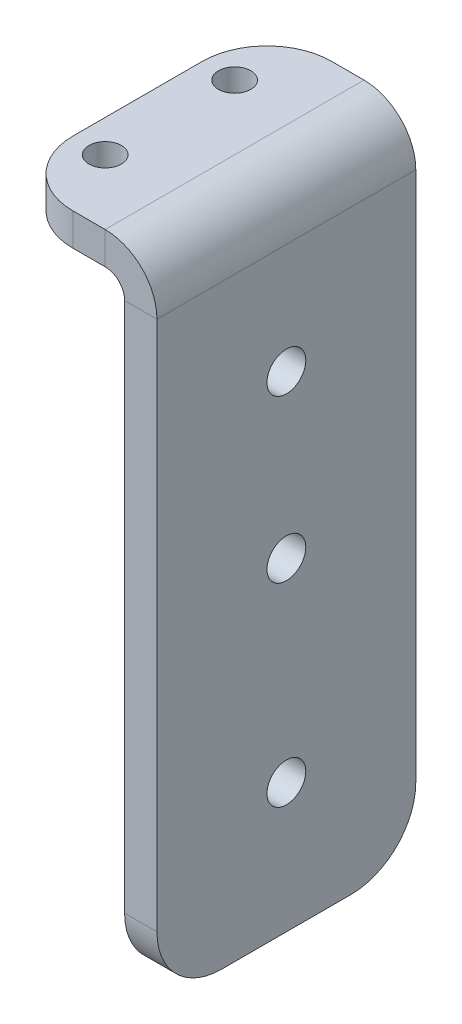
ISO-10303-21;
HEADER;
FILE_DESCRIPTION(('STEP AP214'),'2;1');
FILE_NAME('part.step','',(''),(''),'','','');
FILE_SCHEMA(('AUTOMOTIVE_DESIGN { 1 0 10303 214 1 1 1 1 }'));
ENDSEC;
DATA;
#1=APPLICATION_CONTEXT('core data for automotive mechanical design processes');
#2=APPLICATION_PROTOCOL_DEFINITION('international standard','automotive_design',2000,#1);
#3=PRODUCT_CONTEXT('',#1,'mechanical');
#4=PRODUCT('Part','Part','',(#3));
#5=PRODUCT_RELATED_PRODUCT_CATEGORY('part','',(#4));
#6=PRODUCT_DEFINITION_FORMATION('','',#4);
#7=PRODUCT_DEFINITION_CONTEXT('part definition',#1,'design');
#8=PRODUCT_DEFINITION('design','',#6,#7);
#9=PRODUCT_DEFINITION_SHAPE('','',#8);
#10=(LENGTH_UNIT() NAMED_UNIT(*) SI_UNIT(.MILLI.,.METRE.));
#11=(NAMED_UNIT(*) PLANE_ANGLE_UNIT() SI_UNIT($,.RADIAN.));
#12=(NAMED_UNIT(*) SI_UNIT($,.STERADIAN.) SOLID_ANGLE_UNIT());
#13=UNCERTAINTY_MEASURE_WITH_UNIT(LENGTH_MEASURE(1.E-05),#10,'distance_accuracy_value','');
#14=(GEOMETRIC_REPRESENTATION_CONTEXT(3) GLOBAL_UNCERTAINTY_ASSIGNED_CONTEXT((#13)) GLOBAL_UNIT_ASSIGNED_CONTEXT((#10,
#11,#12)) REPRESENTATION_CONTEXT('',''));
#15=CARTESIAN_POINT('',(0.,0.,0.));
#16=DIRECTION('',(0.,0.,1.));
#17=DIRECTION('',(1.,0.,0.));
#18=AXIS2_PLACEMENT_3D('',#15,#16,#17);
#19=CARTESIAN_POINT('',(-5.,50.,-20.));
#20=DIRECTION('',(0.,0.,-1.));
#21=DIRECTION('',(0.,1.,0.));
#22=AXIS2_PLACEMENT_3D('',#19,#20,#21);
#23=PLANE('',#22);
#24=DIRECTION('',(0.,1.,0.));
#25=VECTOR('',#24,1.);
#26=CARTESIAN_POINT('',(0.,50.,-20.));
#27=LINE('',#26,#25);
#28=CARTESIAN_POINT('',(0.,-40.,-20.));
#29=VERTEX_POINT('',#28);
#30=CARTESIAN_POINT('',(0.,42.,-20.));
#31=VERTEX_POINT('',#30);
#32=EDGE_CURVE('E203',#29,#31,#27,.T.);
#33=ORIENTED_EDGE('',*,*,#32,.F.);
#34=DIRECTION('',(1.,0.,0.));
#35=VECTOR('',#34,1.);
#36=CARTESIAN_POINT('',(-5.,-40.,-20.));
#37=LINE('',#36,#35);
#38=CARTESIAN_POINT('',(-5.,-40.,-20.));
#39=VERTEX_POINT('',#38);
#40=EDGE_CURVE('E229',#29,#39,#37,.F.);
#41=ORIENTED_EDGE('',*,*,#40,.T.);
#42=DIRECTION('',(0.,1.,0.));
#43=VECTOR('',#42,1.);
#44=CARTESIAN_POINT('',(-5.,50.,-20.));
#45=LINE('',#44,#43);
#46=CARTESIAN_POINT('',(-5.,42.,-20.));
#47=VERTEX_POINT('',#46);
#48=EDGE_CURVE('E205',#39,#47,#45,.T.);
#49=ORIENTED_EDGE('',*,*,#48,.T.);
#50=DIRECTION('',(1.,0.,0.));
#51=VECTOR('',#50,1.);
#52=CARTESIAN_POINT('',(-5.,42.,-20.));
#53=LINE('',#52,#51);
#54=EDGE_CURVE('E193',#47,#31,#53,.T.);
#55=ORIENTED_EDGE('',*,*,#54,.T.);
#56=EDGE_LOOP('',(#33,#41,#49,#55));
#57=FACE_BOUND('',#56,.T.);
#58=ADVANCED_FACE('F59',(#57),#23,.T.);
#59=CARTESIAN_POINT('',(-5.,0.,0.));
#60=DIRECTION('',(1.,0.,0.));
#61=DIRECTION('',(0.,0.,-1.));
#62=AXIS2_PLACEMENT_3D('',#59,#60,#61);
#63=PLANE('',#62);
#64=CARTESIAN_POINT('',(-5.,25.,0.));
#65=DIRECTION('',(1.,0.,0.));
#66=DIRECTION('',(0.,0.,-1.));
#67=AXIS2_PLACEMENT_3D('',#64,#65,#66);
#68=CIRCLE('',#67,3.);
#69=CARTESIAN_POINT('',(-5.,25.,-3.));
#70=VERTEX_POINT('',#69);
#71=EDGE_CURVE('E292',#70,#70,#68,.T.);
#72=ORIENTED_EDGE('',*,*,#71,.T.);
#73=EDGE_LOOP('',(#72));
#74=FACE_BOUND('',#73,.T.);
#75=CARTESIAN_POINT('',(-5.,-30.,0.));
#76=DIRECTION('',(1.,0.,0.));
#77=DIRECTION('',(0.,0.,-1.));
#78=AXIS2_PLACEMENT_3D('',#75,#76,#77);
#79=CIRCLE('',#78,3.);
#80=CARTESIAN_POINT('',(-5.,-30.,-3.));
#81=VERTEX_POINT('',#80);
#82=EDGE_CURVE('E286',#81,#81,#79,.T.);
#83=ORIENTED_EDGE('',*,*,#82,.T.);
#84=EDGE_LOOP('',(#83));
#85=FACE_BOUND('',#84,.T.);
#86=CARTESIAN_POINT('',(-5.,0.,0.));
#87=DIRECTION('',(1.,0.,0.));
#88=DIRECTION('',(0.,0.,-1.));
#89=AXIS2_PLACEMENT_3D('',#86,#87,#88);
#90=CIRCLE('',#89,3.);
#91=CARTESIAN_POINT('',(-5.,0.,-3.));
#92=VERTEX_POINT('',#91);
#93=EDGE_CURVE('E275',#92,#92,#90,.T.);
#94=ORIENTED_EDGE('',*,*,#93,.T.);
#95=EDGE_LOOP('',(#94));
#96=FACE_BOUND('',#95,.T.);
#97=ORIENTED_EDGE('',*,*,#48,.F.);
#98=CARTESIAN_POINT('',(-5.,-40.,-10.));
#99=DIRECTION('',(1.,0.,0.));
#100=DIRECTION('',(0.,0.,-1.));
#101=AXIS2_PLACEMENT_3D('',#98,#99,#100);
#102=CIRCLE('',#101,10.);
#103=CARTESIAN_POINT('',(-5.,-50.,-10.));
#104=VERTEX_POINT('',#103);
#105=EDGE_CURVE('E233',#39,#104,#102,.F.);
#106=ORIENTED_EDGE('',*,*,#105,.T.);
#107=DIRECTION('',(0.,0.,-1.));
#108=VECTOR('',#107,1.);
#109=CARTESIAN_POINT('',(-5.,-50.,20.));
#110=LINE('',#109,#108);
#111=CARTESIAN_POINT('',(-5.,-50.,10.));
#112=VERTEX_POINT('',#111);
#113=EDGE_CURVE('E211',#112,#104,#110,.T.);
#114=ORIENTED_EDGE('',*,*,#113,.F.);
#115=CARTESIAN_POINT('',(-5.,-40.,10.));
#116=DIRECTION('',(1.,0.,0.));
#117=DIRECTION('',(0.,0.,-1.));
#118=AXIS2_PLACEMENT_3D('',#115,#116,#117);
#119=CIRCLE('',#118,10.);
#120=CARTESIAN_POINT('',(-5.,-40.,20.));
#121=VERTEX_POINT('',#120);
#122=EDGE_CURVE('E231',#112,#121,#119,.F.);
#123=ORIENTED_EDGE('',*,*,#122,.T.);
#124=DIRECTION('',(0.,-1.,0.));
#125=VECTOR('',#124,1.);
#126=CARTESIAN_POINT('',(-5.,50.,20.));
#127=LINE('',#126,#125);
#128=CARTESIAN_POINT('',(-5.,42.,20.));
#129=VERTEX_POINT('',#128);
#130=EDGE_CURVE('E207',#129,#121,#127,.T.);
#131=ORIENTED_EDGE('',*,*,#130,.F.);
#132=DIRECTION('',(0.,0.,-1.));
#133=VECTOR('',#132,1.);
#134=CARTESIAN_POINT('',(-5.,42.,-20.));
#135=LINE('',#134,#133);
#136=EDGE_CURVE('E197',#47,#129,#135,.F.);
#137=ORIENTED_EDGE('',*,*,#136,.F.);
#138=EDGE_LOOP('',(#97,#106,#114,#123,#131,#137));
#139=FACE_BOUND('',#138,.T.);
#140=ADVANCED_FACE('F301',(#74,#85,#96,#139),#63,.F.);
#141=CARTESIAN_POINT('',(0.,0.,0.));
#142=DIRECTION('',(1.,0.,0.));
#143=DIRECTION('',(0.,0.,-1.));
#144=AXIS2_PLACEMENT_3D('',#141,#142,#143);
#145=PLANE('',#144);
#146=CARTESIAN_POINT('',(0.,25.,0.));
#147=DIRECTION('',(1.,0.,0.));
#148=DIRECTION('',(0.,0.,-1.));
#149=AXIS2_PLACEMENT_3D('',#146,#147,#148);
#150=CIRCLE('',#149,3.);
#151=CARTESIAN_POINT('',(0.,25.,-3.));
#152=VERTEX_POINT('',#151);
#153=EDGE_CURVE('E289',#152,#152,#150,.T.);
#154=ORIENTED_EDGE('',*,*,#153,.F.);
#155=EDGE_LOOP('',(#154));
#156=FACE_BOUND('',#155,.T.);
#157=CARTESIAN_POINT('',(0.,-30.,0.));
#158=DIRECTION('',(1.,0.,0.));
#159=DIRECTION('',(0.,0.,-1.));
#160=AXIS2_PLACEMENT_3D('',#157,#158,#159);
#161=CIRCLE('',#160,3.);
#162=CARTESIAN_POINT('',(0.,-30.,-3.));
#163=VERTEX_POINT('',#162);
#164=EDGE_CURVE('E295',#163,#163,#161,.T.);
#165=ORIENTED_EDGE('',*,*,#164,.F.);
#166=EDGE_LOOP('',(#165));
#167=FACE_BOUND('',#166,.T.);
#168=CARTESIAN_POINT('',(0.,0.,0.));
#169=DIRECTION('',(1.,0.,0.));
#170=DIRECTION('',(0.,0.,-1.));
#171=AXIS2_PLACEMENT_3D('',#168,#169,#170);
#172=CIRCLE('',#171,3.);
#173=CARTESIAN_POINT('',(0.,0.,-3.));
#174=VERTEX_POINT('',#173);
#175=EDGE_CURVE('E283',#174,#174,#172,.T.);
#176=ORIENTED_EDGE('',*,*,#175,.F.);
#177=EDGE_LOOP('',(#176));
#178=FACE_BOUND('',#177,.T.);
#179=DIRECTION('',(0.,0.,-1.));
#180=VECTOR('',#179,1.);
#181=CARTESIAN_POINT('',(0.,-50.,20.));
#182=LINE('',#181,#180);
#183=CARTESIAN_POINT('',(0.,-50.,10.));
#184=VERTEX_POINT('',#183);
#185=CARTESIAN_POINT('',(0.,-50.,-10.));
#186=VERTEX_POINT('',#185);
#187=EDGE_CURVE('E208',#184,#186,#182,.T.);
#188=ORIENTED_EDGE('',*,*,#187,.T.);
#189=CARTESIAN_POINT('',(0.,-40.,-10.));
#190=DIRECTION('',(1.,0.,0.));
#191=DIRECTION('',(0.,0.,-1.));
#192=AXIS2_PLACEMENT_3D('',#189,#190,#191);
#193=CIRCLE('',#192,10.);
#194=EDGE_CURVE('E227',#186,#29,#193,.T.);
#195=ORIENTED_EDGE('',*,*,#194,.T.);
#196=ORIENTED_EDGE('',*,*,#32,.T.);
#197=DIRECTION('',(0.,0.,-1.));
#198=VECTOR('',#197,1.);
#199=CARTESIAN_POINT('',(0.,42.,-20.));
#200=LINE('',#199,#198);
#201=CARTESIAN_POINT('',(0.,42.,20.));
#202=VERTEX_POINT('',#201);
#203=EDGE_CURVE('E163',#31,#202,#200,.F.);
#204=ORIENTED_EDGE('',*,*,#203,.T.);
#205=DIRECTION('',(0.,-1.,0.));
#206=VECTOR('',#205,1.);
#207=CARTESIAN_POINT('',(0.,50.,20.));
#208=LINE('',#207,#206);
#209=CARTESIAN_POINT('',(0.,-40.,20.));
#210=VERTEX_POINT('',#209);
#211=EDGE_CURVE('E216',#202,#210,#208,.T.);
#212=ORIENTED_EDGE('',*,*,#211,.T.);
#213=CARTESIAN_POINT('',(0.,-40.,10.));
#214=DIRECTION('',(1.,0.,0.));
#215=DIRECTION('',(0.,0.,-1.));
#216=AXIS2_PLACEMENT_3D('',#213,#214,#215);
#217=CIRCLE('',#216,10.);
#218=EDGE_CURVE('E225',#210,#184,#217,.T.);
#219=ORIENTED_EDGE('',*,*,#218,.T.);
#220=EDGE_LOOP('',(#188,#195,#196,#204,#212,#219));
#221=FACE_BOUND('',#220,.T.);
#222=ADVANCED_FACE('F312',(#156,#167,#178,#221),#145,.T.);
#223=CARTESIAN_POINT('',(-5.,-50.,20.));
#224=DIRECTION('',(0.,-1.,0.));
#225=DIRECTION('',(0.,0.,-1.));
#226=AXIS2_PLACEMENT_3D('',#223,#224,#225);
#227=PLANE('',#226);
#228=ORIENTED_EDGE('',*,*,#113,.T.);
#229=DIRECTION('',(1.,0.,0.));
#230=VECTOR('',#229,1.);
#231=CARTESIAN_POINT('',(-5.,-50.,-10.));
#232=LINE('',#231,#230);
#233=EDGE_CURVE('E222',#104,#186,#232,.T.);
#234=ORIENTED_EDGE('',*,*,#233,.T.);
#235=ORIENTED_EDGE('',*,*,#187,.F.);
#236=DIRECTION('',(1.,0.,0.));
#237=VECTOR('',#236,1.);
#238=CARTESIAN_POINT('',(-5.,-50.,10.));
#239=LINE('',#238,#237);
#240=EDGE_CURVE('E214',#184,#112,#239,.F.);
#241=ORIENTED_EDGE('',*,*,#240,.T.);
#242=EDGE_LOOP('',(#228,#234,#235,#241));
#243=FACE_BOUND('',#242,.T.);
#244=ADVANCED_FACE('F315',(#243),#227,.T.);
#245=CARTESIAN_POINT('',(-5.,50.,20.));
#246=DIRECTION('',(0.,0.,1.));
#247=DIRECTION('',(0.,-1.,0.));
#248=AXIS2_PLACEMENT_3D('',#245,#246,#247);
#249=PLANE('',#248);
#250=ORIENTED_EDGE('',*,*,#130,.T.);
#251=DIRECTION('',(1.,0.,0.));
#252=VECTOR('',#251,1.);
#253=CARTESIAN_POINT('',(-5.,-40.,20.));
#254=LINE('',#253,#252);
#255=EDGE_CURVE('E235',#121,#210,#254,.T.);
#256=ORIENTED_EDGE('',*,*,#255,.T.);
#257=ORIENTED_EDGE('',*,*,#211,.F.);
#258=DIRECTION('',(1.,0.,0.));
#259=VECTOR('',#258,1.);
#260=CARTESIAN_POINT('',(-5.,42.,20.));
#261=LINE('',#260,#259);
#262=EDGE_CURVE('E200',#129,#202,#261,.T.);
#263=ORIENTED_EDGE('',*,*,#262,.F.);
#264=EDGE_LOOP('',(#250,#256,#257,#263));
#265=FACE_BOUND('',#264,.T.);
#266=ADVANCED_FACE('F336',(#265),#249,.T.);
#267=CARTESIAN_POINT('',(-8.,42.,20.));
#268=DIRECTION('',(0.,0.,1.));
#269=DIRECTION('',(1.,0.,0.));
#270=AXIS2_PLACEMENT_3D('',#267,#268,#269);
#271=PLANE('',#270);
#272=DIRECTION('',(0.,1.,0.));
#273=VECTOR('',#272,1.);
#274=CARTESIAN_POINT('',(-7.99999999999997,50.,20.));
#275=LINE('',#274,#273);
#276=CARTESIAN_POINT('',(-7.99999999999999,45.,20.));
#277=VERTEX_POINT('',#276);
#278=CARTESIAN_POINT('',(-7.99999999999997,50.,20.));
#279=VERTEX_POINT('',#278);
#280=EDGE_CURVE('E187',#277,#279,#275,.T.);
#281=ORIENTED_EDGE('',*,*,#280,.F.);
#282=CARTESIAN_POINT('',(-8.,42.,20.));
#283=DIRECTION('',(0.,0.,-1.));
#284=DIRECTION('',(-1.,0.,0.));
#285=AXIS2_PLACEMENT_3D('',#282,#283,#284);
#286=CIRCLE('',#285,3.);
#287=EDGE_CURVE('E167',#129,#277,#286,.F.);
#288=ORIENTED_EDGE('',*,*,#287,.F.);
#289=ORIENTED_EDGE('',*,*,#262,.T.);
#290=CARTESIAN_POINT('',(-8.,42.,20.));
#291=DIRECTION('',(0.,0.,-1.));
#292=DIRECTION('',(-1.,0.,0.));
#293=AXIS2_PLACEMENT_3D('',#290,#291,#292);
#294=CIRCLE('',#293,8.);
#295=EDGE_CURVE('E192',#202,#279,#294,.F.);
#296=ORIENTED_EDGE('',*,*,#295,.T.);
#297=EDGE_LOOP('',(#281,#288,#289,#296));
#298=FACE_BOUND('',#297,.T.);
#299=ADVANCED_FACE('F340',(#298),#271,.T.);
#300=CARTESIAN_POINT('',(-8.,42.,-20.));
#301=DIRECTION('',(0.,0.,1.));
#302=DIRECTION('',(1.,0.,0.));
#303=AXIS2_PLACEMENT_3D('',#300,#301,#302);
#304=PLANE('',#303);
#305=CARTESIAN_POINT('',(-8.,42.,-20.));
#306=DIRECTION('',(0.,0.,-1.));
#307=DIRECTION('',(-1.,0.,0.));
#308=AXIS2_PLACEMENT_3D('',#305,#306,#307);
#309=CIRCLE('',#308,3.);
#310=CARTESIAN_POINT('',(-7.99999999999999,45.,-20.));
#311=VERTEX_POINT('',#310);
#312=EDGE_CURVE('E152',#311,#47,#309,.T.);
#313=ORIENTED_EDGE('',*,*,#312,.F.);
#314=DIRECTION('',(0.,1.,0.));
#315=VECTOR('',#314,1.);
#316=CARTESIAN_POINT('',(-7.99999999999999,45.,-20.));
#317=LINE('',#316,#315);
#318=CARTESIAN_POINT('',(-7.99999999999997,50.,-20.));
#319=VERTEX_POINT('',#318);
#320=EDGE_CURVE('E150',#311,#319,#317,.T.);
#321=ORIENTED_EDGE('',*,*,#320,.T.);
#322=CARTESIAN_POINT('',(-8.,42.,-20.));
#323=DIRECTION('',(0.,0.,-1.));
#324=DIRECTION('',(-1.,0.,0.));
#325=AXIS2_PLACEMENT_3D('',#322,#323,#324);
#326=CIRCLE('',#325,8.);
#327=EDGE_CURVE('E158',#319,#31,#326,.T.);
#328=ORIENTED_EDGE('',*,*,#327,.T.);
#329=ORIENTED_EDGE('',*,*,#54,.F.);
#330=EDGE_LOOP('',(#313,#321,#328,#329));
#331=FACE_BOUND('',#330,.T.);
#332=ADVANCED_FACE('F170',(#331),#304,.F.);
#333=CARTESIAN_POINT('',(-8.,42.,-20.));
#334=DIRECTION('',(0.,0.,-1.));
#335=DIRECTION('',(0.,1.,0.));
#336=AXIS2_PLACEMENT_3D('',#333,#334,#335);
#337=CYLINDRICAL_SURFACE('',#336,8.);
#338=ORIENTED_EDGE('',*,*,#203,.F.);
#339=ORIENTED_EDGE('',*,*,#327,.F.);
#340=DIRECTION('',(0.,0.,-1.));
#341=VECTOR('',#340,1.);
#342=CARTESIAN_POINT('',(-7.99999999999997,50.,0.));
#343=LINE('',#342,#341);
#344=EDGE_CURVE('E160',#279,#319,#343,.T.);
#345=ORIENTED_EDGE('',*,*,#344,.F.);
#346=ORIENTED_EDGE('',*,*,#295,.F.);
#347=EDGE_LOOP('',(#338,#339,#345,#346));
#348=FACE_BOUND('',#347,.T.);
#349=ADVANCED_FACE('F159',(#348),#337,.T.);
#350=CARTESIAN_POINT('',(-8.,42.,-20.));
#351=DIRECTION('',(0.,0.,-1.));
#352=DIRECTION('',(0.,1.,0.));
#353=AXIS2_PLACEMENT_3D('',#350,#351,#352);
#354=CYLINDRICAL_SURFACE('',#353,3.);
#355=ORIENTED_EDGE('',*,*,#136,.T.);
#356=ORIENTED_EDGE('',*,*,#287,.T.);
#357=DIRECTION('',(0.,0.,1.));
#358=VECTOR('',#357,1.);
#359=CARTESIAN_POINT('',(-7.99999999999999,45.,20.));
#360=LINE('',#359,#358);
#361=EDGE_CURVE('E172',#277,#311,#360,.F.);
#362=ORIENTED_EDGE('',*,*,#361,.T.);
#363=ORIENTED_EDGE('',*,*,#312,.T.);
#364=EDGE_LOOP('',(#355,#356,#362,#363));
#365=FACE_BOUND('',#364,.T.);
#366=ADVANCED_FACE('F347',(#365),#354,.F.);
#367=CARTESIAN_POINT('',(-4.99999999999998,50.,-20.));
#368=DIRECTION('',(0.,0.,-1.));
#369=DIRECTION('',(-1.,0.,0.));
#370=AXIS2_PLACEMENT_3D('',#367,#368,#369);
#371=PLANE('',#370);
#372=DIRECTION('',(-1.,0.,0.));
#373=VECTOR('',#372,1.);
#374=CARTESIAN_POINT('',(1.73472347597681E-13,45.,-20.));
#375=LINE('',#374,#373);
#376=CARTESIAN_POINT('',(-13.,45.,-20.));
#377=VERTEX_POINT('',#376);
#378=EDGE_CURVE('E257',#377,#311,#375,.F.);
#379=ORIENTED_EDGE('',*,*,#378,.F.);
#380=DIRECTION('',(0.,-1.,0.));
#381=VECTOR('',#380,1.);
#382=CARTESIAN_POINT('',(-13.,50.,-20.));
#383=LINE('',#382,#381);
#384=CARTESIAN_POINT('',(-13.,50.,-20.));
#385=VERTEX_POINT('',#384);
#386=EDGE_CURVE('E13',#377,#385,#383,.F.);
#387=ORIENTED_EDGE('',*,*,#386,.T.);
#388=DIRECTION('',(1.,0.,0.));
#389=VECTOR('',#388,1.);
#390=CARTESIAN_POINT('',(-4.99999999999998,50.,-20.));
#391=LINE('',#390,#389);
#392=EDGE_CURVE('E146',#385,#319,#391,.T.);
#393=ORIENTED_EDGE('',*,*,#392,.T.);
#394=ORIENTED_EDGE('',*,*,#320,.F.);
#395=EDGE_LOOP('',(#379,#387,#393,#394));
#396=FACE_BOUND('',#395,.T.);
#397=ADVANCED_FACE('F148',(#396),#371,.T.);
#398=CARTESIAN_POINT('',(-23.,50.0000000000001,20.));
#399=DIRECTION('',(0.,0.,1.));
#400=DIRECTION('',(1.,0.,0.));
#401=AXIS2_PLACEMENT_3D('',#398,#399,#400);
#402=PLANE('',#401);
#403=DIRECTION('',(-1.,0.,0.));
#404=VECTOR('',#403,1.);
#405=CARTESIAN_POINT('',(-23.,50.0000000000001,20.));
#406=LINE('',#405,#404);
#407=CARTESIAN_POINT('',(-13.,50.,20.));
#408=VERTEX_POINT('',#407);
#409=EDGE_CURVE('E177',#279,#408,#406,.T.);
#410=ORIENTED_EDGE('',*,*,#409,.T.);
#411=DIRECTION('',(0.,-1.,0.));
#412=VECTOR('',#411,1.);
#413=CARTESIAN_POINT('',(-13.,50.,20.));
#414=LINE('',#413,#412);
#415=CARTESIAN_POINT('',(-13.,45.,20.));
#416=VERTEX_POINT('',#415);
#417=EDGE_CURVE('E238',#408,#416,#414,.T.);
#418=ORIENTED_EDGE('',*,*,#417,.T.);
#419=DIRECTION('',(1.,0.,0.));
#420=VECTOR('',#419,1.);
#421=CARTESIAN_POINT('',(1.73472347597681E-13,45.,20.));
#422=LINE('',#421,#420);
#423=EDGE_CURVE('E178',#277,#416,#422,.F.);
#424=ORIENTED_EDGE('',*,*,#423,.F.);
#425=ORIENTED_EDGE('',*,*,#280,.T.);
#426=EDGE_LOOP('',(#410,#418,#424,#425));
#427=FACE_BOUND('',#426,.T.);
#428=ADVANCED_FACE('F255',(#427),#402,.T.);
#429=CARTESIAN_POINT('',(1.90929754291896E-13,50.,0.));
#430=DIRECTION('',(0.,1.,0.));
#431=DIRECTION('',(-1.,0.,0.));
#432=AXIS2_PLACEMENT_3D('',#429,#430,#431);
#433=PLANE('',#432);
#434=CARTESIAN_POINT('',(-18.,50.,-10.));
#435=DIRECTION('',(0.,1.,0.));
#436=DIRECTION('',(-1.,0.,0.));
#437=AXIS2_PLACEMENT_3D('',#434,#435,#436);
#438=CIRCLE('',#437,2.5);
#439=CARTESIAN_POINT('',(-20.5,50.0000000000001,-10.));
#440=VERTEX_POINT('',#439);
#441=EDGE_CURVE('E278',#440,#440,#438,.T.);
#442=ORIENTED_EDGE('',*,*,#441,.F.);
#443=EDGE_LOOP('',(#442));
#444=FACE_BOUND('',#443,.T.);
#445=CARTESIAN_POINT('',(-18.,50.,10.));
#446=DIRECTION('',(0.,1.,0.));
#447=DIRECTION('',(-1.,0.,0.));
#448=AXIS2_PLACEMENT_3D('',#445,#446,#447);
#449=CIRCLE('',#448,2.5);
#450=CARTESIAN_POINT('',(-20.5,50.0000000000001,10.));
#451=VERTEX_POINT('',#450);
#452=EDGE_CURVE('E271',#451,#451,#449,.T.);
#453=ORIENTED_EDGE('',*,*,#452,.F.);
#454=EDGE_LOOP('',(#453));
#455=FACE_BOUND('',#454,.T.);
#456=DIRECTION('',(0.,0.,-1.));
#457=VECTOR('',#456,1.);
#458=CARTESIAN_POINT('',(-23.,50.0000000000001,-20.));
#459=LINE('',#458,#457);
#460=CARTESIAN_POINT('',(-23.,50.0000000000001,10.));
#461=VERTEX_POINT('',#460);
#462=CARTESIAN_POINT('',(-23.,50.0000000000001,-9.99999999999999));
#463=VERTEX_POINT('',#462);
#464=EDGE_CURVE('E153',#461,#463,#459,.T.);
#465=ORIENTED_EDGE('',*,*,#464,.F.);
#466=CARTESIAN_POINT('',(-13.,50.,10.));
#467=DIRECTION('',(0.,1.,0.));
#468=DIRECTION('',(-1.,0.,0.));
#469=AXIS2_PLACEMENT_3D('',#466,#467,#468);
#470=CIRCLE('',#469,10.);
#471=EDGE_CURVE('E67',#461,#408,#470,.T.);
#472=ORIENTED_EDGE('',*,*,#471,.T.);
#473=ORIENTED_EDGE('',*,*,#409,.F.);
#474=ORIENTED_EDGE('',*,*,#344,.T.);
#475=ORIENTED_EDGE('',*,*,#392,.F.);
#476=CARTESIAN_POINT('',(-13.,50.,-9.99999999999999));
#477=DIRECTION('',(0.,1.,0.));
#478=DIRECTION('',(-1.,0.,0.));
#479=AXIS2_PLACEMENT_3D('',#476,#477,#478);
#480=CIRCLE('',#479,10.);
#481=EDGE_CURVE('E79',#385,#463,#480,.T.);
#482=ORIENTED_EDGE('',*,*,#481,.T.);
#483=EDGE_LOOP('',(#465,#472,#473,#474,#475,#482));
#484=FACE_BOUND('',#483,.T.);
#485=ADVANCED_FACE('F175',(#444,#455,#484),#433,.T.);
#486=CARTESIAN_POINT('',(1.73472347597681E-13,45.,0.));
#487=DIRECTION('',(0.,1.,0.));
#488=DIRECTION('',(-1.,0.,0.));
#489=AXIS2_PLACEMENT_3D('',#486,#487,#488);
#490=PLANE('',#489);
#491=CARTESIAN_POINT('',(-18.,45.0000000000001,-10.));
#492=DIRECTION('',(0.,1.,0.));
#493=DIRECTION('',(-1.,0.,0.));
#494=AXIS2_PLACEMENT_3D('',#491,#492,#493);
#495=CIRCLE('',#494,2.5);
#496=CARTESIAN_POINT('',(-20.5,45.0000000000001,-10.));
#497=VERTEX_POINT('',#496);
#498=EDGE_CURVE('E190',#497,#497,#495,.T.);
#499=ORIENTED_EDGE('',*,*,#498,.T.);
#500=EDGE_LOOP('',(#499));
#501=FACE_BOUND('',#500,.T.);
#502=CARTESIAN_POINT('',(-18.,45.0000000000001,10.));
#503=DIRECTION('',(0.,1.,0.));
#504=DIRECTION('',(-1.,0.,0.));
#505=AXIS2_PLACEMENT_3D('',#502,#503,#504);
#506=CIRCLE('',#505,2.5);
#507=CARTESIAN_POINT('',(-20.5,45.0000000000001,10.));
#508=VERTEX_POINT('',#507);
#509=EDGE_CURVE('E274',#508,#508,#506,.T.);
#510=ORIENTED_EDGE('',*,*,#509,.T.);
#511=EDGE_LOOP('',(#510));
#512=FACE_BOUND('',#511,.T.);
#513=ORIENTED_EDGE('',*,*,#423,.T.);
#514=CARTESIAN_POINT('',(-13.,45.,10.));
#515=DIRECTION('',(0.,1.,0.));
#516=DIRECTION('',(-1.,0.,0.));
#517=AXIS2_PLACEMENT_3D('',#514,#515,#516);
#518=CIRCLE('',#517,10.);
#519=CARTESIAN_POINT('',(-23.,45.0000000000001,10.));
#520=VERTEX_POINT('',#519);
#521=EDGE_CURVE('E243',#416,#520,#518,.F.);
#522=ORIENTED_EDGE('',*,*,#521,.T.);
#523=DIRECTION('',(0.,0.,1.));
#524=VECTOR('',#523,1.);
#525=CARTESIAN_POINT('',(-23.,45.0000000000001,0.));
#526=LINE('',#525,#524);
#527=CARTESIAN_POINT('',(-23.,45.0000000000001,-9.99999999999999));
#528=VERTEX_POINT('',#527);
#529=EDGE_CURVE('E181',#520,#528,#526,.F.);
#530=ORIENTED_EDGE('',*,*,#529,.T.);
#531=CARTESIAN_POINT('',(-13.,45.,-9.99999999999999));
#532=DIRECTION('',(0.,1.,0.));
#533=DIRECTION('',(-1.,0.,0.));
#534=AXIS2_PLACEMENT_3D('',#531,#532,#533);
#535=CIRCLE('',#534,10.);
#536=EDGE_CURVE('E241',#528,#377,#535,.F.);
#537=ORIENTED_EDGE('',*,*,#536,.T.);
#538=ORIENTED_EDGE('',*,*,#378,.T.);
#539=ORIENTED_EDGE('',*,*,#361,.F.);
#540=EDGE_LOOP('',(#513,#522,#530,#537,#538,#539));
#541=FACE_BOUND('',#540,.T.);
#542=ADVANCED_FACE('F263',(#501,#512,#541),#490,.F.);
#543=CARTESIAN_POINT('',(-23.,50.0000000000001,-20.));
#544=DIRECTION('',(-1.,0.,0.));
#545=DIRECTION('',(0.,-1.,0.));
#546=AXIS2_PLACEMENT_3D('',#543,#544,#545);
#547=PLANE('',#546);
#548=ORIENTED_EDGE('',*,*,#529,.F.);
#549=DIRECTION('',(0.,-1.,0.));
#550=VECTOR('',#549,1.);
#551=CARTESIAN_POINT('',(-23.,50.0000000000001,10.));
#552=LINE('',#551,#550);
#553=EDGE_CURVE('E248',#520,#461,#552,.F.);
#554=ORIENTED_EDGE('',*,*,#553,.T.);
#555=ORIENTED_EDGE('',*,*,#464,.T.);
#556=DIRECTION('',(0.,-1.,0.));
#557=VECTOR('',#556,1.);
#558=CARTESIAN_POINT('',(-23.,50.0000000000001,-9.99999999999999));
#559=LINE('',#558,#557);
#560=EDGE_CURVE('E245',#463,#528,#559,.T.);
#561=ORIENTED_EDGE('',*,*,#560,.T.);
#562=EDGE_LOOP('',(#548,#554,#555,#561));
#563=FACE_BOUND('',#562,.T.);
#564=ADVANCED_FACE('F266',(#563),#547,.T.);
#565=CARTESIAN_POINT('',(-18.,45.0000000000001,10.));
#566=DIRECTION('',(0.,1.,0.));
#567=DIRECTION('',(-1.,0.,0.));
#568=AXIS2_PLACEMENT_3D('',#565,#566,#567);
#569=CYLINDRICAL_SURFACE('',#568,2.5);
#570=ORIENTED_EDGE('',*,*,#509,.F.);
#571=EDGE_LOOP('',(#570));
#572=FACE_BOUND('',#571,.T.);
#573=ORIENTED_EDGE('',*,*,#452,.T.);
#574=EDGE_LOOP('',(#573));
#575=FACE_BOUND('',#574,.T.);
#576=ADVANCED_FACE('F433',(#572,#575),#569,.F.);
#577=CARTESIAN_POINT('',(-18.,45.0000000000001,-10.));
#578=DIRECTION('',(0.,1.,0.));
#579=DIRECTION('',(-1.,0.,0.));
#580=AXIS2_PLACEMENT_3D('',#577,#578,#579);
#581=CYLINDRICAL_SURFACE('',#580,2.5);
#582=ORIENTED_EDGE('',*,*,#498,.F.);
#583=EDGE_LOOP('',(#582));
#584=FACE_BOUND('',#583,.T.);
#585=ORIENTED_EDGE('',*,*,#441,.T.);
#586=EDGE_LOOP('',(#585));
#587=FACE_BOUND('',#586,.T.);
#588=ADVANCED_FACE('F368',(#584,#587),#581,.F.);
#589=CARTESIAN_POINT('',(-5.,-40.,-10.));
#590=DIRECTION('',(1.,0.,0.));
#591=DIRECTION('',(0.,0.,-1.));
#592=AXIS2_PLACEMENT_3D('',#589,#590,#591);
#593=CYLINDRICAL_SURFACE('',#592,10.);
#594=ORIENTED_EDGE('',*,*,#105,.F.);
#595=ORIENTED_EDGE('',*,*,#40,.F.);
#596=ORIENTED_EDGE('',*,*,#194,.F.);
#597=ORIENTED_EDGE('',*,*,#233,.F.);
#598=EDGE_LOOP('',(#594,#595,#596,#597));
#599=FACE_BOUND('',#598,.T.);
#600=ADVANCED_FACE('F345',(#599),#593,.T.);
#601=CARTESIAN_POINT('',(-5.,-40.,10.));
#602=DIRECTION('',(1.,0.,0.));
#603=DIRECTION('',(0.,0.,-1.));
#604=AXIS2_PLACEMENT_3D('',#601,#602,#603);
#605=CYLINDRICAL_SURFACE('',#604,10.);
#606=ORIENTED_EDGE('',*,*,#122,.F.);
#607=ORIENTED_EDGE('',*,*,#240,.F.);
#608=ORIENTED_EDGE('',*,*,#218,.F.);
#609=ORIENTED_EDGE('',*,*,#255,.F.);
#610=EDGE_LOOP('',(#606,#607,#608,#609));
#611=FACE_BOUND('',#610,.T.);
#612=ADVANCED_FACE('F328',(#611),#605,.T.);
#613=CARTESIAN_POINT('',(-13.,50.,10.));
#614=DIRECTION('',(0.,-1.,0.));
#615=DIRECTION('',(1.,0.,0.));
#616=AXIS2_PLACEMENT_3D('',#613,#614,#615);
#617=CYLINDRICAL_SURFACE('',#616,10.);
#618=ORIENTED_EDGE('',*,*,#471,.F.);
#619=ORIENTED_EDGE('',*,*,#553,.F.);
#620=ORIENTED_EDGE('',*,*,#521,.F.);
#621=ORIENTED_EDGE('',*,*,#417,.F.);
#622=EDGE_LOOP('',(#618,#619,#620,#621));
#623=FACE_BOUND('',#622,.T.);
#624=ADVANCED_FACE('F259',(#623),#617,.T.);
#625=CARTESIAN_POINT('',(-13.,50.,-9.99999999999999));
#626=DIRECTION('',(0.,-1.,0.));
#627=DIRECTION('',(1.,0.,0.));
#628=AXIS2_PLACEMENT_3D('',#625,#626,#627);
#629=CYLINDRICAL_SURFACE('',#628,10.);
#630=ORIENTED_EDGE('',*,*,#481,.F.);
#631=ORIENTED_EDGE('',*,*,#386,.F.);
#632=ORIENTED_EDGE('',*,*,#536,.F.);
#633=ORIENTED_EDGE('',*,*,#560,.F.);
#634=EDGE_LOOP('',(#630,#631,#632,#633));
#635=FACE_BOUND('',#634,.T.);
#636=ADVANCED_FACE('F61',(#635),#629,.T.);
#637=CARTESIAN_POINT('',(-5.,0.,0.));
#638=DIRECTION('',(1.,0.,0.));
#639=DIRECTION('',(0.,0.,-1.));
#640=AXIS2_PLACEMENT_3D('',#637,#638,#639);
#641=CYLINDRICAL_SURFACE('',#640,3.);
#642=ORIENTED_EDGE('',*,*,#93,.F.);
#643=EDGE_LOOP('',(#642));
#644=FACE_BOUND('',#643,.T.);
#645=ORIENTED_EDGE('',*,*,#175,.T.);
#646=EDGE_LOOP('',(#645));
#647=FACE_BOUND('',#646,.T.);
#648=ADVANCED_FACE('F308',(#644,#647),#641,.F.);
#649=CARTESIAN_POINT('',(-5.,-30.,0.));
#650=DIRECTION('',(1.,0.,0.));
#651=DIRECTION('',(0.,0.,-1.));
#652=AXIS2_PLACEMENT_3D('',#649,#650,#651);
#653=CYLINDRICAL_SURFACE('',#652,3.);
#654=ORIENTED_EDGE('',*,*,#82,.F.);
#655=EDGE_LOOP('',(#654));
#656=FACE_BOUND('',#655,.T.);
#657=ORIENTED_EDGE('',*,*,#164,.T.);
#658=EDGE_LOOP('',(#657));
#659=FACE_BOUND('',#658,.T.);
#660=ADVANCED_FACE('F304',(#656,#659),#653,.F.);
#661=CARTESIAN_POINT('',(-5.,25.,0.));
#662=DIRECTION('',(1.,0.,0.));
#663=DIRECTION('',(0.,0.,-1.));
#664=AXIS2_PLACEMENT_3D('',#661,#662,#663);
#665=CYLINDRICAL_SURFACE('',#664,3.);
#666=ORIENTED_EDGE('',*,*,#71,.F.);
#667=EDGE_LOOP('',(#666));
#668=FACE_BOUND('',#667,.T.);
#669=ORIENTED_EDGE('',*,*,#153,.T.);
#670=EDGE_LOOP('',(#669));
#671=FACE_BOUND('',#670,.T.);
#672=ADVANCED_FACE('F307',(#668,#671),#665,.F.);
#673=CLOSED_SHELL('',(#58,#140,#222,#244,#266,#299,#332,#349,#366,#397,#428,#485,#542,#564,#576,
#588,#600,#612,#624,#636,#648,#660,#672));
#674=MANIFOLD_SOLID_BREP('B2',#673);
#675=ADVANCED_BREP_SHAPE_REPRESENTATION('',(#18,#674),#14);
#676=SHAPE_DEFINITION_REPRESENTATION(#9,#675);
ENDSEC;
END-ISO-10303-21;
